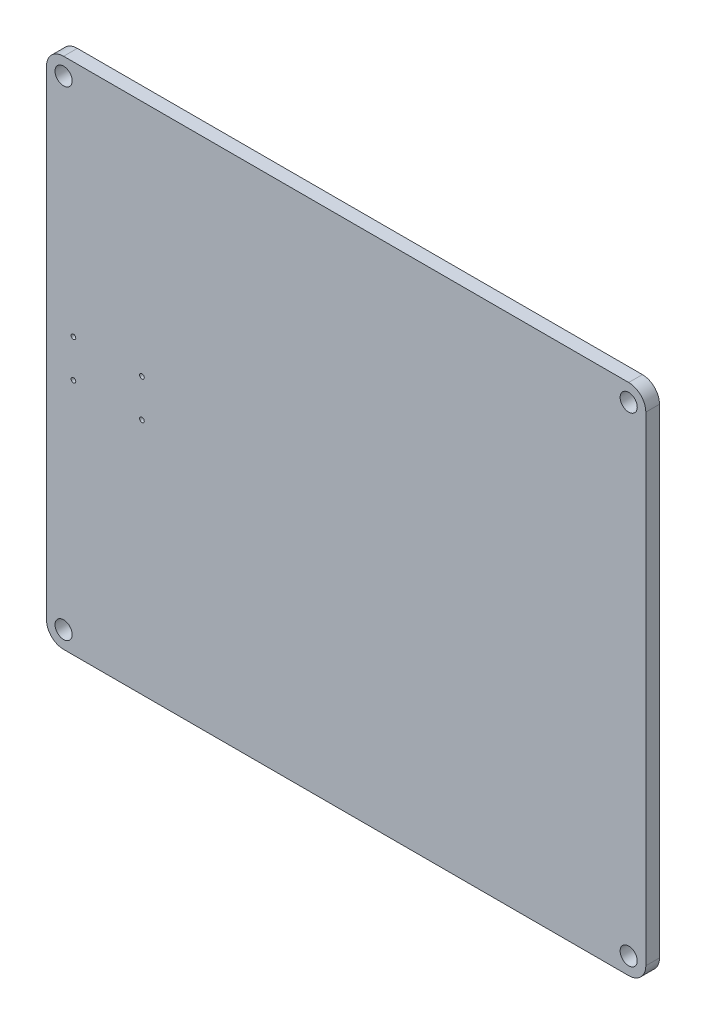
ISO-10303-21;
HEADER;
FILE_DESCRIPTION(('STEP AP214'),'2;1');
FILE_NAME('part.step','',(''),(''),'','','');
FILE_SCHEMA(('AUTOMOTIVE_DESIGN { 1 0 10303 214 1 1 1 1 }'));
ENDSEC;
DATA;
#1=APPLICATION_CONTEXT('core data for automotive mechanical design processes');
#2=APPLICATION_PROTOCOL_DEFINITION('international standard','automotive_design',2000,#1);
#3=PRODUCT_CONTEXT('',#1,'mechanical');
#4=PRODUCT('Part','Part','',(#3));
#5=PRODUCT_RELATED_PRODUCT_CATEGORY('part','',(#4));
#6=PRODUCT_DEFINITION_FORMATION('','',#4);
#7=PRODUCT_DEFINITION_CONTEXT('part definition',#1,'design');
#8=PRODUCT_DEFINITION('design','',#6,#7);
#9=PRODUCT_DEFINITION_SHAPE('','',#8);
#10=(LENGTH_UNIT() NAMED_UNIT(*) SI_UNIT(.MILLI.,.METRE.));
#11=(NAMED_UNIT(*) PLANE_ANGLE_UNIT() SI_UNIT($,.RADIAN.));
#12=(NAMED_UNIT(*) SI_UNIT($,.STERADIAN.) SOLID_ANGLE_UNIT());
#13=UNCERTAINTY_MEASURE_WITH_UNIT(LENGTH_MEASURE(1.E-05),#10,'distance_accuracy_value','');
#14=(GEOMETRIC_REPRESENTATION_CONTEXT(3) GLOBAL_UNCERTAINTY_ASSIGNED_CONTEXT((#13)) GLOBAL_UNIT_ASSIGNED_CONTEXT((#10,
#11,#12)) REPRESENTATION_CONTEXT('',''));
#15=CARTESIAN_POINT('',(0.,0.,0.));
#16=DIRECTION('',(0.,0.,1.));
#17=DIRECTION('',(1.,0.,0.));
#18=AXIS2_PLACEMENT_3D('',#15,#16,#17);
#19=CARTESIAN_POINT('',(-47.7962419390678,150.256112217903,-8.));
#20=DIRECTION('',(-1.,0.,0.));
#21=DIRECTION('',(0.,-1.,0.));
#22=AXIS2_PLACEMENT_3D('',#19,#20,#21);
#23=PLANE('',#22);
#24=DIRECTION('',(0.,-1.,0.));
#25=VECTOR('',#24,1.);
#26=CARTESIAN_POINT('',(-47.7962419390678,150.256112217903,0.));
#27=LINE('',#26,#25);
#28=CARTESIAN_POINT('',(-47.7962419390678,140.256112217903,0.));
#29=VERTEX_POINT('',#28);
#30=CARTESIAN_POINT('',(-47.7962419390678,-139.743899703026,0.));
#31=VERTEX_POINT('',#30);
#32=EDGE_CURVE('E159',#29,#31,#27,.T.);
#33=ORIENTED_EDGE('',*,*,#32,.F.);
#34=DIRECTION('',(0.,0.,1.));
#35=VECTOR('',#34,1.);
#36=CARTESIAN_POINT('',(-47.7962419390678,140.256112217903,-8.));
#37=LINE('',#36,#35);
#38=CARTESIAN_POINT('',(-47.7962419390678,140.256112217903,-8.));
#39=VERTEX_POINT('',#38);
#40=EDGE_CURVE('E139',#29,#39,#37,.F.);
#41=ORIENTED_EDGE('',*,*,#40,.T.);
#42=DIRECTION('',(0.,-1.,0.));
#43=VECTOR('',#42,1.);
#44=CARTESIAN_POINT('',(-47.7962419390678,150.256112217903,-8.));
#45=LINE('',#44,#43);
#46=CARTESIAN_POINT('',(-47.7962419390678,-139.743899703026,-8.));
#47=VERTEX_POINT('',#46);
#48=EDGE_CURVE('E120',#39,#47,#45,.T.);
#49=ORIENTED_EDGE('',*,*,#48,.T.);
#50=DIRECTION('',(0.,0.,1.));
#51=VECTOR('',#50,1.);
#52=CARTESIAN_POINT('',(-47.7962419390678,-139.743899703026,-8.));
#53=LINE('',#52,#51);
#54=EDGE_CURVE('E136',#47,#31,#53,.T.);
#55=ORIENTED_EDGE('',*,*,#54,.T.);
#56=EDGE_LOOP('',(#33,#41,#49,#55));
#57=FACE_BOUND('',#56,.T.);
#58=ADVANCED_FACE('F33',(#57),#23,.T.);
#59=CARTESIAN_POINT('',(-47.7962419390678,150.256112217903,-8.));
#60=DIRECTION('',(0.,1.,0.));
#61=DIRECTION('',(0.,0.,1.));
#62=AXIS2_PLACEMENT_3D('',#59,#60,#61);
#63=PLANE('',#62);
#64=DIRECTION('',(-1.,0.,0.));
#65=VECTOR('',#64,1.);
#66=CARTESIAN_POINT('',(-47.7962419390678,150.256112217903,-8.));
#67=LINE('',#66,#65);
#68=CARTESIAN_POINT('',(292.203774452209,150.256112217903,-8.));
#69=VERTEX_POINT('',#68);
#70=CARTESIAN_POINT('',(-37.7962419390678,150.256112217903,-8.));
#71=VERTEX_POINT('',#70);
#72=EDGE_CURVE('E125',#69,#71,#67,.T.);
#73=ORIENTED_EDGE('',*,*,#72,.T.);
#74=DIRECTION('',(0.,0.,1.));
#75=VECTOR('',#74,1.);
#76=CARTESIAN_POINT('',(-37.7962419390678,150.256112217903,-8.));
#77=LINE('',#76,#75);
#78=CARTESIAN_POINT('',(-37.7962419390678,150.256112217903,0.));
#79=VERTEX_POINT('',#78);
#80=EDGE_CURVE('E119',#71,#79,#77,.T.);
#81=ORIENTED_EDGE('',*,*,#80,.T.);
#82=DIRECTION('',(-1.,0.,0.));
#83=VECTOR('',#82,1.);
#84=CARTESIAN_POINT('',(-47.7962419390678,150.256112217903,0.));
#85=LINE('',#84,#83);
#86=CARTESIAN_POINT('',(292.203774452209,150.256112217903,0.));
#87=VERTEX_POINT('',#86);
#88=EDGE_CURVE('E102',#87,#79,#85,.T.);
#89=ORIENTED_EDGE('',*,*,#88,.F.);
#90=DIRECTION('',(0.,0.,1.));
#91=VECTOR('',#90,1.);
#92=CARTESIAN_POINT('',(292.203774452209,150.256112217903,-8.));
#93=LINE('',#92,#91);
#94=EDGE_CURVE('E116',#87,#69,#93,.F.);
#95=ORIENTED_EDGE('',*,*,#94,.T.);
#96=EDGE_LOOP('',(#73,#81,#89,#95));
#97=FACE_BOUND('',#96,.T.);
#98=ADVANCED_FACE('F115',(#97),#63,.T.);
#99=CARTESIAN_POINT('',(302.203774452209,150.256112217903,-8.));
#100=DIRECTION('',(1.,0.,0.));
#101=DIRECTION('',(0.,1.,0.));
#102=AXIS2_PLACEMENT_3D('',#99,#100,#101);
#103=PLANE('',#102);
#104=DIRECTION('',(0.,1.,0.));
#105=VECTOR('',#104,1.);
#106=CARTESIAN_POINT('',(302.203774452209,150.256112217903,-8.));
#107=LINE('',#106,#105);
#108=CARTESIAN_POINT('',(302.20377445221,-139.743899703026,-8.));
#109=VERTEX_POINT('',#108);
#110=CARTESIAN_POINT('',(302.203774452209,140.256112217903,-8.));
#111=VERTEX_POINT('',#110);
#112=EDGE_CURVE('E129',#109,#111,#107,.T.);
#113=ORIENTED_EDGE('',*,*,#112,.T.);
#114=DIRECTION('',(0.,0.,1.));
#115=VECTOR('',#114,1.);
#116=CARTESIAN_POINT('',(302.203774452209,140.256112217903,-8.));
#117=LINE('',#116,#115);
#118=CARTESIAN_POINT('',(302.203774452209,140.256112217903,0.));
#119=VERTEX_POINT('',#118);
#120=EDGE_CURVE('E149',#111,#119,#117,.T.);
#121=ORIENTED_EDGE('',*,*,#120,.T.);
#122=DIRECTION('',(0.,1.,0.));
#123=VECTOR('',#122,1.);
#124=CARTESIAN_POINT('',(302.203774452209,150.256112217903,0.));
#125=LINE('',#124,#123);
#126=CARTESIAN_POINT('',(302.20377445221,-139.743899703026,0.));
#127=VERTEX_POINT('',#126);
#128=EDGE_CURVE('E104',#127,#119,#125,.T.);
#129=ORIENTED_EDGE('',*,*,#128,.F.);
#130=DIRECTION('',(0.,0.,1.));
#131=VECTOR('',#130,1.);
#132=CARTESIAN_POINT('',(302.20377445221,-139.743899703026,-8.));
#133=LINE('',#132,#131);
#134=EDGE_CURVE('E147',#127,#109,#133,.F.);
#135=ORIENTED_EDGE('',*,*,#134,.T.);
#136=EDGE_LOOP('',(#113,#121,#129,#135));
#137=FACE_BOUND('',#136,.T.);
#138=ADVANCED_FACE('F152',(#137),#103,.T.);
#139=CARTESIAN_POINT('',(-47.7962419390678,-149.743899703026,-8.));
#140=DIRECTION('',(0.,-1.,0.));
#141=DIRECTION('',(0.,0.,-1.));
#142=AXIS2_PLACEMENT_3D('',#139,#140,#141);
#143=PLANE('',#142);
#144=DIRECTION('',(1.,0.,0.));
#145=VECTOR('',#144,1.);
#146=CARTESIAN_POINT('',(-47.7962419390678,-149.743899703026,-8.));
#147=LINE('',#146,#145);
#148=CARTESIAN_POINT('',(-37.7962419390678,-149.743899703026,-8.));
#149=VERTEX_POINT('',#148);
#150=CARTESIAN_POINT('',(292.20377445221,-149.743899703026,-8.));
#151=VERTEX_POINT('',#150);
#152=EDGE_CURVE('E154',#149,#151,#147,.T.);
#153=ORIENTED_EDGE('',*,*,#152,.T.);
#154=DIRECTION('',(0.,0.,1.));
#155=VECTOR('',#154,1.);
#156=CARTESIAN_POINT('',(292.20377445221,-149.743899703026,-8.));
#157=LINE('',#156,#155);
#158=CARTESIAN_POINT('',(292.20377445221,-149.743899703026,0.));
#159=VERTEX_POINT('',#158);
#160=EDGE_CURVE('E11',#151,#159,#157,.T.);
#161=ORIENTED_EDGE('',*,*,#160,.T.);
#162=DIRECTION('',(1.,0.,0.));
#163=VECTOR('',#162,1.);
#164=CARTESIAN_POINT('',(-47.7962419390678,-149.743899703026,0.));
#165=LINE('',#164,#163);
#166=CARTESIAN_POINT('',(-37.7962419390678,-149.743899703026,0.));
#167=VERTEX_POINT('',#166);
#168=EDGE_CURVE('E162',#167,#159,#165,.T.);
#169=ORIENTED_EDGE('',*,*,#168,.F.);
#170=DIRECTION('',(0.,0.,1.));
#171=VECTOR('',#170,1.);
#172=CARTESIAN_POINT('',(-37.7962419390678,-149.743899703026,-8.));
#173=LINE('',#172,#171);
#174=EDGE_CURVE('E41',#167,#149,#173,.F.);
#175=ORIENTED_EDGE('',*,*,#174,.T.);
#176=EDGE_LOOP('',(#153,#161,#169,#175));
#177=FACE_BOUND('',#176,.T.);
#178=ADVANCED_FACE('F165',(#177),#143,.T.);
#179=CARTESIAN_POINT('',(0.,0.,-8.));
#180=DIRECTION('',(0.,0.,1.));
#181=DIRECTION('',(1.,0.,0.));
#182=AXIS2_PLACEMENT_3D('',#179,#180,#181);
#183=PLANE('',#182);
#184=CARTESIAN_POINT('',(7.95375339017559,-10.7438879650898,-8.));
#185=DIRECTION('',(0.,0.,1.));
#186=DIRECTION('',(1.,0.,0.));
#187=AXIS2_PLACEMENT_3D('',#184,#185,#186);
#188=CIRCLE('',#187,1.35000137293117);
#189=CARTESIAN_POINT('',(9.30375476310677,-10.7438879650898,-8.));
#190=VERTEX_POINT('',#189);
#191=EDGE_CURVE('E217',#190,#190,#188,.T.);
#192=ORIENTED_EDGE('',*,*,#191,.T.);
#193=EDGE_LOOP('',(#192));
#194=FACE_BOUND('',#193,.T.);
#195=CARTESIAN_POINT('',(7.95375168766605,11.2561093709003,-8.));
#196=DIRECTION('',(0.,0.,1.));
#197=DIRECTION('',(1.,0.,0.));
#198=AXIS2_PLACEMENT_3D('',#195,#196,#197);
#199=CIRCLE('',#198,1.34999937003195);
#200=CARTESIAN_POINT('',(9.303751057698,11.2561093709003,-8.));
#201=VERTEX_POINT('',#200);
#202=EDGE_CURVE('E211',#201,#201,#199,.T.);
#203=ORIENTED_EDGE('',*,*,#202,.T.);
#204=EDGE_LOOP('',(#203));
#205=FACE_BOUND('',#204,.T.);
#206=CARTESIAN_POINT('',(-32.0462497925628,-10.7438939807359,-8.));
#207=DIRECTION('',(0.,0.,1.));
#208=DIRECTION('',(1.,0.,0.));
#209=AXIS2_PLACEMENT_3D('',#206,#207,#208);
#210=CIRCLE('',#209,1.35000550655318);
#211=CARTESIAN_POINT('',(-30.6962442860096,-10.7438939807359,-8.));
#212=VERTEX_POINT('',#211);
#213=EDGE_CURVE('E205',#212,#212,#210,.T.);
#214=ORIENTED_EDGE('',*,*,#213,.T.);
#215=EDGE_LOOP('',(#214));
#216=FACE_BOUND('',#215,.T.);
#217=CARTESIAN_POINT('',(-32.0462482148633,11.2561114369411,-8.));
#218=DIRECTION('',(0.,0.,1.));
#219=DIRECTION('',(1.,0.,0.));
#220=AXIS2_PLACEMENT_3D('',#217,#218,#219);
#221=CIRCLE('',#220,1.35000041728977);
#222=CARTESIAN_POINT('',(-30.6962477975736,11.2561114369411,-8.));
#223=VERTEX_POINT('',#222);
#224=EDGE_CURVE('E199',#223,#223,#221,.T.);
#225=ORIENTED_EDGE('',*,*,#224,.T.);
#226=EDGE_LOOP('',(#225));
#227=FACE_BOUND('',#226,.T.);
#228=CARTESIAN_POINT('',(-37.7964665860722,-139.744600635441,-8.));
#229=DIRECTION('',(0.,0.,1.));
#230=DIRECTION('',(1.,0.,0.));
#231=AXIS2_PLACEMENT_3D('',#228,#229,#230);
#232=CIRCLE('',#231,4.99955295424076);
#233=CARTESIAN_POINT('',(-32.7969136318314,-139.744600635441,-8.));
#234=VERTEX_POINT('',#233);
#235=EDGE_CURVE('E193',#234,#234,#232,.T.);
#236=ORIENTED_EDGE('',*,*,#235,.T.);
#237=EDGE_LOOP('',(#236));
#238=FACE_BOUND('',#237,.T.);
#239=CARTESIAN_POINT('',(292.203759754508,-139.743888869719,-8.));
#240=DIRECTION('',(0.,0.,1.));
#241=DIRECTION('',(1.,0.,0.));
#242=AXIS2_PLACEMENT_3D('',#239,#240,#241);
#243=CIRCLE('',#242,4.99998976274313);
#244=CARTESIAN_POINT('',(297.203749517251,-139.743888869719,-8.));
#245=VERTEX_POINT('',#244);
#246=EDGE_CURVE('E187',#245,#245,#243,.T.);
#247=ORIENTED_EDGE('',*,*,#246,.T.);
#248=EDGE_LOOP('',(#247));
#249=FACE_BOUND('',#248,.T.);
#250=CARTESIAN_POINT('',(292.203740841034,140.256105050791,-8.));
#251=DIRECTION('',(0.,0.,1.));
#252=DIRECTION('',(1.,0.,0.));
#253=AXIS2_PLACEMENT_3D('',#250,#251,#252);
#254=CIRCLE('',#253,5.00000374804546);
#255=CARTESIAN_POINT('',(297.20374458908,140.256105050791,-8.));
#256=VERTEX_POINT('',#255);
#257=EDGE_CURVE('E181',#256,#256,#254,.T.);
#258=ORIENTED_EDGE('',*,*,#257,.T.);
#259=EDGE_LOOP('',(#258));
#260=FACE_BOUND('',#259,.T.);
#261=CARTESIAN_POINT('',(-37.7962543813287,140.256114437116,-8.));
#262=DIRECTION('',(0.,0.,1.));
#263=DIRECTION('',(1.,0.,0.));
#264=AXIS2_PLACEMENT_3D('',#261,#262,#263);
#265=CIRCLE('',#264,5.00001235990435);
#266=CARTESIAN_POINT('',(-32.7962420214243,140.256114437116,-8.));
#267=VERTEX_POINT('',#266);
#268=EDGE_CURVE('E163',#267,#267,#265,.T.);
#269=ORIENTED_EDGE('',*,*,#268,.T.);
#270=EDGE_LOOP('',(#269));
#271=FACE_BOUND('',#270,.T.);
#272=ORIENTED_EDGE('',*,*,#48,.F.);
#273=CARTESIAN_POINT('',(-37.7962419390678,140.256112217903,-8.));
#274=DIRECTION('',(0.,0.,1.));
#275=DIRECTION('',(1.,0.,0.));
#276=AXIS2_PLACEMENT_3D('',#273,#274,#275);
#277=CIRCLE('',#276,10.);
#278=EDGE_CURVE('E145',#39,#71,#277,.F.);
#279=ORIENTED_EDGE('',*,*,#278,.T.);
#280=ORIENTED_EDGE('',*,*,#72,.F.);
#281=CARTESIAN_POINT('',(292.203774452209,140.256112217903,-8.));
#282=DIRECTION('',(0.,0.,1.));
#283=DIRECTION('',(1.,0.,0.));
#284=AXIS2_PLACEMENT_3D('',#281,#282,#283);
#285=CIRCLE('',#284,10.);
#286=EDGE_CURVE('E124',#69,#111,#285,.F.);
#287=ORIENTED_EDGE('',*,*,#286,.T.);
#288=ORIENTED_EDGE('',*,*,#112,.F.);
#289=CARTESIAN_POINT('',(292.20377445221,-139.743899703026,-8.));
#290=DIRECTION('',(0.,0.,1.));
#291=DIRECTION('',(1.,0.,0.));
#292=AXIS2_PLACEMENT_3D('',#289,#290,#291);
#293=CIRCLE('',#292,10.);
#294=EDGE_CURVE('E48',#109,#151,#293,.F.);
#295=ORIENTED_EDGE('',*,*,#294,.T.);
#296=ORIENTED_EDGE('',*,*,#152,.F.);
#297=CARTESIAN_POINT('',(-37.7962419390678,-139.743899703026,-8.));
#298=DIRECTION('',(0.,0.,1.));
#299=DIRECTION('',(1.,0.,0.));
#300=AXIS2_PLACEMENT_3D('',#297,#298,#299);
#301=CIRCLE('',#300,10.);
#302=EDGE_CURVE('E141',#149,#47,#301,.F.);
#303=ORIENTED_EDGE('',*,*,#302,.T.);
#304=EDGE_LOOP('',(#272,#279,#280,#287,#288,#295,#296,#303));
#305=FACE_BOUND('',#304,.T.);
#306=ADVANCED_FACE('F172',(#194,#205,#216,#227,#238,#249,#260,#271,#305),#183,.F.);
#307=CARTESIAN_POINT('',(0.,0.,0.));
#308=DIRECTION('',(0.,0.,1.));
#309=DIRECTION('',(1.,0.,0.));
#310=AXIS2_PLACEMENT_3D('',#307,#308,#309);
#311=PLANE('',#310);
#312=CARTESIAN_POINT('',(7.95375339017559,-10.7438879650898,0.));
#313=DIRECTION('',(0.,0.,1.));
#314=DIRECTION('',(1.,0.,0.));
#315=AXIS2_PLACEMENT_3D('',#312,#313,#314);
#316=CIRCLE('',#315,1.35000137293117);
#317=CARTESIAN_POINT('',(9.30375476310677,-10.7438879650898,0.));
#318=VERTEX_POINT('',#317);
#319=EDGE_CURVE('E220',#318,#318,#316,.T.);
#320=ORIENTED_EDGE('',*,*,#319,.F.);
#321=EDGE_LOOP('',(#320));
#322=FACE_BOUND('',#321,.T.);
#323=CARTESIAN_POINT('',(7.95375168766605,11.2561093709003,0.));
#324=DIRECTION('',(0.,0.,1.));
#325=DIRECTION('',(1.,0.,0.));
#326=AXIS2_PLACEMENT_3D('',#323,#324,#325);
#327=CIRCLE('',#326,1.34999937003195);
#328=CARTESIAN_POINT('',(9.303751057698,11.2561093709003,0.));
#329=VERTEX_POINT('',#328);
#330=EDGE_CURVE('E214',#329,#329,#327,.T.);
#331=ORIENTED_EDGE('',*,*,#330,.F.);
#332=EDGE_LOOP('',(#331));
#333=FACE_BOUND('',#332,.T.);
#334=CARTESIAN_POINT('',(-32.0462497925628,-10.7438939807359,0.));
#335=DIRECTION('',(0.,0.,1.));
#336=DIRECTION('',(1.,0.,0.));
#337=AXIS2_PLACEMENT_3D('',#334,#335,#336);
#338=CIRCLE('',#337,1.35000550655318);
#339=CARTESIAN_POINT('',(-30.6962442860096,-10.7438939807359,0.));
#340=VERTEX_POINT('',#339);
#341=EDGE_CURVE('E208',#340,#340,#338,.T.);
#342=ORIENTED_EDGE('',*,*,#341,.F.);
#343=EDGE_LOOP('',(#342));
#344=FACE_BOUND('',#343,.T.);
#345=CARTESIAN_POINT('',(-32.0462482148633,11.2561114369411,0.));
#346=DIRECTION('',(0.,0.,1.));
#347=DIRECTION('',(1.,0.,0.));
#348=AXIS2_PLACEMENT_3D('',#345,#346,#347);
#349=CIRCLE('',#348,1.35000041728977);
#350=CARTESIAN_POINT('',(-30.6962477975736,11.2561114369411,0.));
#351=VERTEX_POINT('',#350);
#352=EDGE_CURVE('E202',#351,#351,#349,.T.);
#353=ORIENTED_EDGE('',*,*,#352,.F.);
#354=EDGE_LOOP('',(#353));
#355=FACE_BOUND('',#354,.T.);
#356=CARTESIAN_POINT('',(-37.7964665860722,-139.744600635441,0.));
#357=DIRECTION('',(0.,0.,1.));
#358=DIRECTION('',(1.,0.,0.));
#359=AXIS2_PLACEMENT_3D('',#356,#357,#358);
#360=CIRCLE('',#359,4.99955295424076);
#361=CARTESIAN_POINT('',(-32.7969136318314,-139.744600635441,0.));
#362=VERTEX_POINT('',#361);
#363=EDGE_CURVE('E196',#362,#362,#360,.T.);
#364=ORIENTED_EDGE('',*,*,#363,.F.);
#365=EDGE_LOOP('',(#364));
#366=FACE_BOUND('',#365,.T.);
#367=CARTESIAN_POINT('',(292.203759754508,-139.743888869719,0.));
#368=DIRECTION('',(0.,0.,1.));
#369=DIRECTION('',(1.,0.,0.));
#370=AXIS2_PLACEMENT_3D('',#367,#368,#369);
#371=CIRCLE('',#370,4.99998976274313);
#372=CARTESIAN_POINT('',(297.203749517251,-139.743888869719,0.));
#373=VERTEX_POINT('',#372);
#374=EDGE_CURVE('E190',#373,#373,#371,.T.);
#375=ORIENTED_EDGE('',*,*,#374,.F.);
#376=EDGE_LOOP('',(#375));
#377=FACE_BOUND('',#376,.T.);
#378=CARTESIAN_POINT('',(292.203740841034,140.256105050791,0.));
#379=DIRECTION('',(0.,0.,1.));
#380=DIRECTION('',(1.,0.,0.));
#381=AXIS2_PLACEMENT_3D('',#378,#379,#380);
#382=CIRCLE('',#381,5.00000374804546);
#383=CARTESIAN_POINT('',(297.20374458908,140.256105050791,0.));
#384=VERTEX_POINT('',#383);
#385=EDGE_CURVE('E184',#384,#384,#382,.T.);
#386=ORIENTED_EDGE('',*,*,#385,.F.);
#387=EDGE_LOOP('',(#386));
#388=FACE_BOUND('',#387,.T.);
#389=CARTESIAN_POINT('',(-37.7962543813287,140.256114437116,0.));
#390=DIRECTION('',(0.,0.,1.));
#391=DIRECTION('',(1.,0.,0.));
#392=AXIS2_PLACEMENT_3D('',#389,#390,#391);
#393=CIRCLE('',#392,5.00001235990435);
#394=CARTESIAN_POINT('',(-32.7962420214243,140.256114437116,0.));
#395=VERTEX_POINT('',#394);
#396=EDGE_CURVE('E178',#395,#395,#393,.T.);
#397=ORIENTED_EDGE('',*,*,#396,.F.);
#398=EDGE_LOOP('',(#397));
#399=FACE_BOUND('',#398,.T.);
#400=ORIENTED_EDGE('',*,*,#88,.T.);
#401=CARTESIAN_POINT('',(-37.7962419390678,140.256112217903,0.));
#402=DIRECTION('',(0.,0.,1.));
#403=DIRECTION('',(1.,0.,0.));
#404=AXIS2_PLACEMENT_3D('',#401,#402,#403);
#405=CIRCLE('',#404,10.);
#406=EDGE_CURVE('E109',#79,#29,#405,.T.);
#407=ORIENTED_EDGE('',*,*,#406,.T.);
#408=ORIENTED_EDGE('',*,*,#32,.T.);
#409=CARTESIAN_POINT('',(-37.7962419390678,-139.743899703026,0.));
#410=DIRECTION('',(0.,0.,1.));
#411=DIRECTION('',(1.,0.,0.));
#412=AXIS2_PLACEMENT_3D('',#409,#410,#411);
#413=CIRCLE('',#412,10.);
#414=EDGE_CURVE('E127',#31,#167,#413,.T.);
#415=ORIENTED_EDGE('',*,*,#414,.T.);
#416=ORIENTED_EDGE('',*,*,#168,.T.);
#417=CARTESIAN_POINT('',(292.20377445221,-139.743899703026,0.));
#418=DIRECTION('',(0.,0.,1.));
#419=DIRECTION('',(1.,0.,0.));
#420=AXIS2_PLACEMENT_3D('',#417,#418,#419);
#421=CIRCLE('',#420,10.);
#422=EDGE_CURVE('E110',#159,#127,#421,.T.);
#423=ORIENTED_EDGE('',*,*,#422,.T.);
#424=ORIENTED_EDGE('',*,*,#128,.T.);
#425=CARTESIAN_POINT('',(292.203774452209,140.256112217903,0.));
#426=DIRECTION('',(0.,0.,1.));
#427=DIRECTION('',(1.,0.,0.));
#428=AXIS2_PLACEMENT_3D('',#425,#426,#427);
#429=CIRCLE('',#428,10.);
#430=EDGE_CURVE('E99',#119,#87,#429,.T.);
#431=ORIENTED_EDGE('',*,*,#430,.T.);
#432=EDGE_LOOP('',(#400,#407,#408,#415,#416,#423,#424,#431));
#433=FACE_BOUND('',#432,.T.);
#434=ADVANCED_FACE('F101',(#322,#333,#344,#355,#366,#377,#388,#399,#433),#311,.T.);
#435=CARTESIAN_POINT('',(-37.7962543813287,140.256114437116,-8.));
#436=DIRECTION('',(0.,0.,1.));
#437=DIRECTION('',(1.,0.,0.));
#438=AXIS2_PLACEMENT_3D('',#435,#436,#437);
#439=CYLINDRICAL_SURFACE('',#438,5.00001235990435);
#440=ORIENTED_EDGE('',*,*,#268,.F.);
#441=EDGE_LOOP('',(#440));
#442=FACE_BOUND('',#441,.T.);
#443=ORIENTED_EDGE('',*,*,#396,.T.);
#444=EDGE_LOOP('',(#443));
#445=FACE_BOUND('',#444,.T.);
#446=ADVANCED_FACE('F238',(#442,#445),#439,.F.);
#447=CARTESIAN_POINT('',(292.203740841034,140.256105050791,-8.));
#448=DIRECTION('',(0.,0.,1.));
#449=DIRECTION('',(1.,0.,0.));
#450=AXIS2_PLACEMENT_3D('',#447,#448,#449);
#451=CYLINDRICAL_SURFACE('',#450,5.00000374804546);
#452=ORIENTED_EDGE('',*,*,#257,.F.);
#453=EDGE_LOOP('',(#452));
#454=FACE_BOUND('',#453,.T.);
#455=ORIENTED_EDGE('',*,*,#385,.T.);
#456=EDGE_LOOP('',(#455));
#457=FACE_BOUND('',#456,.T.);
#458=ADVANCED_FACE('F255',(#454,#457),#451,.F.);
#459=CARTESIAN_POINT('',(292.203759754508,-139.743888869719,-8.));
#460=DIRECTION('',(0.,0.,1.));
#461=DIRECTION('',(1.,0.,0.));
#462=AXIS2_PLACEMENT_3D('',#459,#460,#461);
#463=CYLINDRICAL_SURFACE('',#462,4.99998976274313);
#464=ORIENTED_EDGE('',*,*,#246,.F.);
#465=EDGE_LOOP('',(#464));
#466=FACE_BOUND('',#465,.T.);
#467=ORIENTED_EDGE('',*,*,#374,.T.);
#468=EDGE_LOOP('',(#467));
#469=FACE_BOUND('',#468,.T.);
#470=ADVANCED_FACE('F261',(#466,#469),#463,.F.);
#471=CARTESIAN_POINT('',(-37.7964665860722,-139.744600635441,-8.));
#472=DIRECTION('',(0.,0.,1.));
#473=DIRECTION('',(1.,0.,0.));
#474=AXIS2_PLACEMENT_3D('',#471,#472,#473);
#475=CYLINDRICAL_SURFACE('',#474,4.99955295424076);
#476=ORIENTED_EDGE('',*,*,#235,.F.);
#477=EDGE_LOOP('',(#476));
#478=FACE_BOUND('',#477,.T.);
#479=ORIENTED_EDGE('',*,*,#363,.T.);
#480=EDGE_LOOP('',(#479));
#481=FACE_BOUND('',#480,.T.);
#482=ADVANCED_FACE('F376',(#478,#481),#475,.F.);
#483=CARTESIAN_POINT('',(-32.0462482148633,11.2561114369411,-8.));
#484=DIRECTION('',(0.,0.,1.));
#485=DIRECTION('',(1.,0.,0.));
#486=AXIS2_PLACEMENT_3D('',#483,#484,#485);
#487=CYLINDRICAL_SURFACE('',#486,1.35000041728977);
#488=ORIENTED_EDGE('',*,*,#224,.F.);
#489=EDGE_LOOP('',(#488));
#490=FACE_BOUND('',#489,.T.);
#491=ORIENTED_EDGE('',*,*,#352,.T.);
#492=EDGE_LOOP('',(#491));
#493=FACE_BOUND('',#492,.T.);
#494=ADVANCED_FACE('F366',(#490,#493),#487,.F.);
#495=CARTESIAN_POINT('',(-32.0462497925628,-10.7438939807359,-8.));
#496=DIRECTION('',(0.,0.,1.));
#497=DIRECTION('',(1.,0.,0.));
#498=AXIS2_PLACEMENT_3D('',#495,#496,#497);
#499=CYLINDRICAL_SURFACE('',#498,1.35000550655318);
#500=ORIENTED_EDGE('',*,*,#213,.F.);
#501=EDGE_LOOP('',(#500));
#502=FACE_BOUND('',#501,.T.);
#503=ORIENTED_EDGE('',*,*,#341,.T.);
#504=EDGE_LOOP('',(#503));
#505=FACE_BOUND('',#504,.T.);
#506=ADVANCED_FACE('F356',(#502,#505),#499,.F.);
#507=CARTESIAN_POINT('',(7.95375168766605,11.2561093709003,-8.));
#508=DIRECTION('',(0.,0.,1.));
#509=DIRECTION('',(1.,0.,0.));
#510=AXIS2_PLACEMENT_3D('',#507,#508,#509);
#511=CYLINDRICAL_SURFACE('',#510,1.34999937003195);
#512=ORIENTED_EDGE('',*,*,#202,.F.);
#513=EDGE_LOOP('',(#512));
#514=FACE_BOUND('',#513,.T.);
#515=ORIENTED_EDGE('',*,*,#330,.T.);
#516=EDGE_LOOP('',(#515));
#517=FACE_BOUND('',#516,.T.);
#518=ADVANCED_FACE('F232',(#514,#517),#511,.F.);
#519=CARTESIAN_POINT('',(7.95375339017559,-10.7438879650898,-8.));
#520=DIRECTION('',(0.,0.,1.));
#521=DIRECTION('',(1.,0.,0.));
#522=AXIS2_PLACEMENT_3D('',#519,#520,#521);
#523=CYLINDRICAL_SURFACE('',#522,1.35000137293117);
#524=ORIENTED_EDGE('',*,*,#191,.F.);
#525=EDGE_LOOP('',(#524));
#526=FACE_BOUND('',#525,.T.);
#527=ORIENTED_EDGE('',*,*,#319,.T.);
#528=EDGE_LOOP('',(#527));
#529=FACE_BOUND('',#528,.T.);
#530=ADVANCED_FACE('F228',(#526,#529),#523,.F.);
#531=CARTESIAN_POINT('',(-37.7962419390678,140.256112217903,-8.));
#532=DIRECTION('',(0.,0.,1.));
#533=DIRECTION('',(1.,0.,0.));
#534=AXIS2_PLACEMENT_3D('',#531,#532,#533);
#535=CYLINDRICAL_SURFACE('',#534,10.);
#536=ORIENTED_EDGE('',*,*,#278,.F.);
#537=ORIENTED_EDGE('',*,*,#40,.F.);
#538=ORIENTED_EDGE('',*,*,#406,.F.);
#539=ORIENTED_EDGE('',*,*,#80,.F.);
#540=EDGE_LOOP('',(#536,#537,#538,#539));
#541=FACE_BOUND('',#540,.T.);
#542=ADVANCED_FACE('F231',(#541),#535,.T.);
#543=CARTESIAN_POINT('',(292.203774452209,140.256112217903,-8.));
#544=DIRECTION('',(0.,0.,1.));
#545=DIRECTION('',(1.,0.,0.));
#546=AXIS2_PLACEMENT_3D('',#543,#544,#545);
#547=CYLINDRICAL_SURFACE('',#546,10.);
#548=ORIENTED_EDGE('',*,*,#286,.F.);
#549=ORIENTED_EDGE('',*,*,#94,.F.);
#550=ORIENTED_EDGE('',*,*,#430,.F.);
#551=ORIENTED_EDGE('',*,*,#120,.F.);
#552=EDGE_LOOP('',(#548,#549,#550,#551));
#553=FACE_BOUND('',#552,.T.);
#554=ADVANCED_FACE('F123',(#553),#547,.T.);
#555=CARTESIAN_POINT('',(292.20377445221,-139.743899703026,-8.));
#556=DIRECTION('',(0.,0.,1.));
#557=DIRECTION('',(1.,0.,0.));
#558=AXIS2_PLACEMENT_3D('',#555,#556,#557);
#559=CYLINDRICAL_SURFACE('',#558,10.);
#560=ORIENTED_EDGE('',*,*,#294,.F.);
#561=ORIENTED_EDGE('',*,*,#134,.F.);
#562=ORIENTED_EDGE('',*,*,#422,.F.);
#563=ORIENTED_EDGE('',*,*,#160,.F.);
#564=EDGE_LOOP('',(#560,#561,#562,#563));
#565=FACE_BOUND('',#564,.T.);
#566=ADVANCED_FACE('F279',(#565),#559,.T.);
#567=CARTESIAN_POINT('',(-37.7962419390678,-139.743899703026,-8.));
#568=DIRECTION('',(0.,0.,1.));
#569=DIRECTION('',(1.,0.,0.));
#570=AXIS2_PLACEMENT_3D('',#567,#568,#569);
#571=CYLINDRICAL_SURFACE('',#570,10.);
#572=ORIENTED_EDGE('',*,*,#302,.F.);
#573=ORIENTED_EDGE('',*,*,#174,.F.);
#574=ORIENTED_EDGE('',*,*,#414,.F.);
#575=ORIENTED_EDGE('',*,*,#54,.F.);
#576=EDGE_LOOP('',(#572,#573,#574,#575));
#577=FACE_BOUND('',#576,.T.);
#578=ADVANCED_FACE('F35',(#577),#571,.T.);
#579=CLOSED_SHELL('',(#58,#98,#138,#178,#306,#434,#446,#458,#470,#482,#494,#506,#518,#530,#542,
#554,#566,#578));
#580=MANIFOLD_SOLID_BREP('B2',#579);
#581=ADVANCED_BREP_SHAPE_REPRESENTATION('',(#18,#580),#14);
#582=SHAPE_DEFINITION_REPRESENTATION(#9,#581);
ENDSEC;
END-ISO-10303-21;
